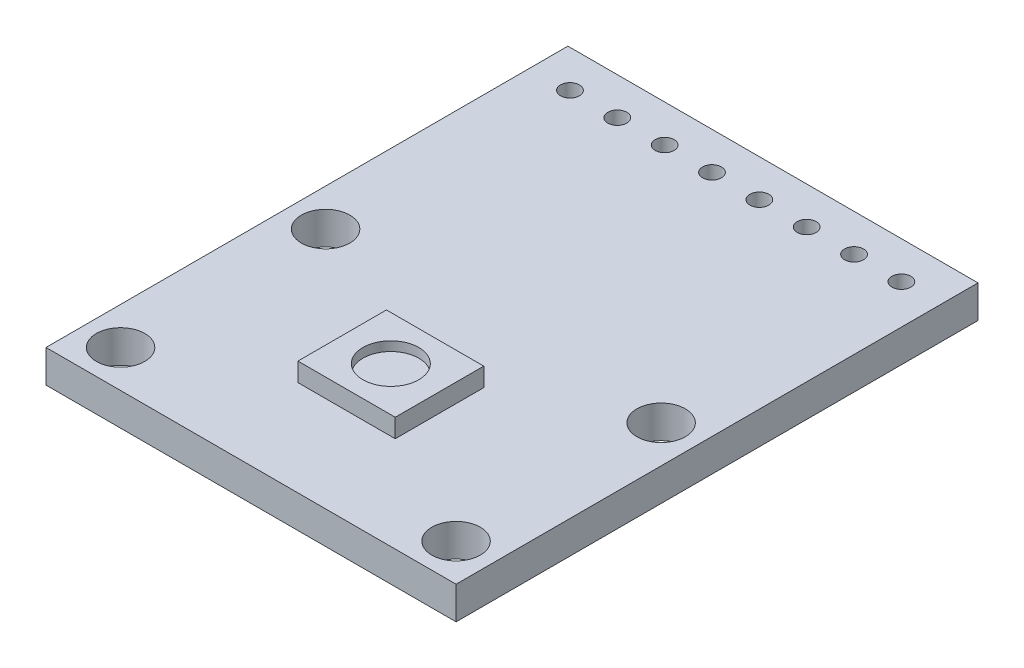
ISO-10303-21;
HEADER;
FILE_DESCRIPTION(('STEP AP214'),'2;1');
FILE_NAME('part.step','',(''),(''),'','','');
FILE_SCHEMA(('AUTOMOTIVE_DESIGN { 1 0 10303 214 1 1 1 1 }'));
ENDSEC;
DATA;
#1=APPLICATION_CONTEXT('core data for automotive mechanical design processes');
#2=APPLICATION_PROTOCOL_DEFINITION('international standard','automotive_design',2000,#1);
#3=PRODUCT_CONTEXT('',#1,'mechanical');
#4=PRODUCT('Part','Part','',(#3));
#5=PRODUCT_RELATED_PRODUCT_CATEGORY('part','',(#4));
#6=PRODUCT_DEFINITION_FORMATION('','',#4);
#7=PRODUCT_DEFINITION_CONTEXT('part definition',#1,'design');
#8=PRODUCT_DEFINITION('design','',#6,#7);
#9=PRODUCT_DEFINITION_SHAPE('','',#8);
#10=(LENGTH_UNIT() NAMED_UNIT(*) SI_UNIT(.MILLI.,.METRE.));
#11=(NAMED_UNIT(*) PLANE_ANGLE_UNIT() SI_UNIT($,.RADIAN.));
#12=(NAMED_UNIT(*) SI_UNIT($,.STERADIAN.) SOLID_ANGLE_UNIT());
#13=UNCERTAINTY_MEASURE_WITH_UNIT(LENGTH_MEASURE(1.E-05),#10,'distance_accuracy_value','');
#14=(GEOMETRIC_REPRESENTATION_CONTEXT(3) GLOBAL_UNCERTAINTY_ASSIGNED_CONTEXT((#13)) GLOBAL_UNIT_ASSIGNED_CONTEXT((#10,
#11,#12)) REPRESENTATION_CONTEXT('',''));
#15=CARTESIAN_POINT('',(0.,0.,0.));
#16=DIRECTION('',(0.,0.,1.));
#17=DIRECTION('',(1.,0.,0.));
#18=AXIS2_PLACEMENT_3D('',#15,#16,#17);
#19=CARTESIAN_POINT('',(0.,1.75,0.));
#20=DIRECTION('',(0.,1.,0.));
#21=DIRECTION('',(0.,0.,1.));
#22=AXIS2_PLACEMENT_3D('',#19,#20,#21);
#23=PLANE('',#22);
#24=CARTESIAN_POINT('',(6.35,1.75,-18.5));
#25=DIRECTION('',(0.,1.,0.));
#26=DIRECTION('',(0.,0.,1.));
#27=AXIS2_PLACEMENT_3D('',#24,#25,#26);
#28=CIRCLE('',#27,0.508);
#29=CARTESIAN_POINT('',(6.35,1.75,-17.992));
#30=VERTEX_POINT('',#29);
#31=EDGE_CURVE('E147',#30,#30,#28,.T.);
#32=ORIENTED_EDGE('',*,*,#31,.F.);
#33=EDGE_LOOP('',(#32));
#34=FACE_BOUND('',#33,.T.);
#35=CARTESIAN_POINT('',(1.27,1.75,-18.5));
#36=DIRECTION('',(0.,1.,0.));
#37=DIRECTION('',(0.,0.,1.));
#38=AXIS2_PLACEMENT_3D('',#35,#36,#37);
#39=CIRCLE('',#38,0.508);
#40=CARTESIAN_POINT('',(1.27,1.75,-17.992));
#41=VERTEX_POINT('',#40);
#42=EDGE_CURVE('E159',#41,#41,#39,.T.);
#43=ORIENTED_EDGE('',*,*,#42,.F.);
#44=EDGE_LOOP('',(#43));
#45=FACE_BOUND('',#44,.T.);
#46=CARTESIAN_POINT('',(-3.81,1.75,-18.5));
#47=DIRECTION('',(0.,1.,0.));
#48=DIRECTION('',(0.,0.,1.));
#49=AXIS2_PLACEMENT_3D('',#46,#47,#48);
#50=CIRCLE('',#49,0.508);
#51=CARTESIAN_POINT('',(-3.81,1.75,-17.992));
#52=VERTEX_POINT('',#51);
#53=EDGE_CURVE('E171',#52,#52,#50,.T.);
#54=ORIENTED_EDGE('',*,*,#53,.F.);
#55=EDGE_LOOP('',(#54));
#56=FACE_BOUND('',#55,.T.);
#57=CARTESIAN_POINT('',(-8.89,1.75,-18.5));
#58=DIRECTION('',(0.,1.,0.));
#59=DIRECTION('',(0.,0.,1.));
#60=AXIS2_PLACEMENT_3D('',#57,#58,#59);
#61=CIRCLE('',#60,0.508);
#62=CARTESIAN_POINT('',(-8.89,1.75,-17.992));
#63=VERTEX_POINT('',#62);
#64=EDGE_CURVE('E183',#63,#63,#61,.T.);
#65=ORIENTED_EDGE('',*,*,#64,.F.);
#66=EDGE_LOOP('',(#65));
#67=FACE_BOUND('',#66,.T.);
#68=CARTESIAN_POINT('',(9.,1.75,5.5));
#69=DIRECTION('',(0.,1.,0.));
#70=DIRECTION('',(0.,0.,1.));
#71=AXIS2_PLACEMENT_3D('',#68,#69,#70);
#72=CIRCLE('',#71,1.3);
#73=CARTESIAN_POINT('',(9.,1.75,6.8));
#74=VERTEX_POINT('',#73);
#75=EDGE_CURVE('E195',#74,#74,#72,.T.);
#76=ORIENTED_EDGE('',*,*,#75,.F.);
#77=EDGE_LOOP('',(#76));
#78=FACE_BOUND('',#77,.T.);
#79=CARTESIAN_POINT('',(-9.,1.75,-5.5));
#80=DIRECTION('',(0.,1.,0.));
#81=DIRECTION('',(0.,0.,1.));
#82=AXIS2_PLACEMENT_3D('',#79,#80,#81);
#83=CIRCLE('',#82,1.3);
#84=CARTESIAN_POINT('',(-9.,1.75,-4.2));
#85=VERTEX_POINT('',#84);
#86=EDGE_CURVE('E207',#85,#85,#83,.T.);
#87=ORIENTED_EDGE('',*,*,#86,.F.);
#88=EDGE_LOOP('',(#87));
#89=FACE_BOUND('',#88,.T.);
#90=DIRECTION('',(0.,0.,1.));
#91=VECTOR('',#90,1.);
#92=CARTESIAN_POINT('',(-11.,1.75,-20.5));
#93=LINE('',#92,#91);
#94=CARTESIAN_POINT('',(-11.,1.75,-20.5));
#95=VERTEX_POINT('',#94);
#96=CARTESIAN_POINT('',(-11.,1.75,7.49999999999999));
#97=VERTEX_POINT('',#96);
#98=EDGE_CURVE('E213',#95,#97,#93,.T.);
#99=ORIENTED_EDGE('',*,*,#98,.T.);
#100=DIRECTION('',(1.,0.,0.));
#101=VECTOR('',#100,1.);
#102=CARTESIAN_POINT('',(-11.,1.75,7.49999999999999));
#103=LINE('',#102,#101);
#104=CARTESIAN_POINT('',(11.,1.75,7.49999999999999));
#105=VERTEX_POINT('',#104);
#106=EDGE_CURVE('E89',#97,#105,#103,.T.);
#107=ORIENTED_EDGE('',*,*,#106,.T.);
#108=DIRECTION('',(0.,0.,-1.));
#109=VECTOR('',#108,1.);
#110=CARTESIAN_POINT('',(11.,1.75,-20.5));
#111=LINE('',#110,#109);
#112=CARTESIAN_POINT('',(11.,1.75,-20.5));
#113=VERTEX_POINT('',#112);
#114=EDGE_CURVE('E216',#105,#113,#111,.T.);
#115=ORIENTED_EDGE('',*,*,#114,.T.);
#116=DIRECTION('',(-1.,0.,0.));
#117=VECTOR('',#116,1.);
#118=CARTESIAN_POINT('',(-11.,1.75,-20.5));
#119=LINE('',#118,#117);
#120=EDGE_CURVE('E61',#113,#95,#119,.T.);
#121=ORIENTED_EDGE('',*,*,#120,.T.);
#122=EDGE_LOOP('',(#99,#107,#115,#121));
#123=FACE_BOUND('',#122,.T.);
#124=CARTESIAN_POINT('',(9.,1.75,-5.5));
#125=DIRECTION('',(0.,1.,0.));
#126=DIRECTION('',(0.,0.,1.));
#127=AXIS2_PLACEMENT_3D('',#124,#125,#126);
#128=CIRCLE('',#127,1.3);
#129=CARTESIAN_POINT('',(9.,1.75,-4.2));
#130=VERTEX_POINT('',#129);
#131=EDGE_CURVE('E201',#130,#130,#128,.T.);
#132=ORIENTED_EDGE('',*,*,#131,.F.);
#133=EDGE_LOOP('',(#132));
#134=FACE_BOUND('',#133,.T.);
#135=CARTESIAN_POINT('',(-9.,1.75,5.5));
#136=DIRECTION('',(0.,1.,0.));
#137=DIRECTION('',(0.,0.,1.));
#138=AXIS2_PLACEMENT_3D('',#135,#136,#137);
#139=CIRCLE('',#138,1.3);
#140=CARTESIAN_POINT('',(-9.,1.75,6.8));
#141=VERTEX_POINT('',#140);
#142=EDGE_CURVE('E189',#141,#141,#139,.T.);
#143=ORIENTED_EDGE('',*,*,#142,.F.);
#144=EDGE_LOOP('',(#143));
#145=FACE_BOUND('',#144,.T.);
#146=CARTESIAN_POINT('',(-6.35,1.75,-18.5));
#147=DIRECTION('',(0.,1.,0.));
#148=DIRECTION('',(0.,0.,1.));
#149=AXIS2_PLACEMENT_3D('',#146,#147,#148);
#150=CIRCLE('',#149,0.508);
#151=CARTESIAN_POINT('',(-6.35,1.75,-17.992));
#152=VERTEX_POINT('',#151);
#153=EDGE_CURVE('E177',#152,#152,#150,.T.);
#154=ORIENTED_EDGE('',*,*,#153,.F.);
#155=EDGE_LOOP('',(#154));
#156=FACE_BOUND('',#155,.T.);
#157=CARTESIAN_POINT('',(-1.27,1.75,-18.5));
#158=DIRECTION('',(0.,1.,0.));
#159=DIRECTION('',(0.,0.,1.));
#160=AXIS2_PLACEMENT_3D('',#157,#158,#159);
#161=CIRCLE('',#160,0.508);
#162=CARTESIAN_POINT('',(-1.27,1.75,-17.992));
#163=VERTEX_POINT('',#162);
#164=EDGE_CURVE('E165',#163,#163,#161,.T.);
#165=ORIENTED_EDGE('',*,*,#164,.F.);
#166=EDGE_LOOP('',(#165));
#167=FACE_BOUND('',#166,.T.);
#168=CARTESIAN_POINT('',(3.81,1.75,-18.5));
#169=DIRECTION('',(0.,1.,0.));
#170=DIRECTION('',(0.,0.,1.));
#171=AXIS2_PLACEMENT_3D('',#168,#169,#170);
#172=CIRCLE('',#171,0.508);
#173=CARTESIAN_POINT('',(3.81,1.75,-17.992));
#174=VERTEX_POINT('',#173);
#175=EDGE_CURVE('E153',#174,#174,#172,.T.);
#176=ORIENTED_EDGE('',*,*,#175,.F.);
#177=EDGE_LOOP('',(#176));
#178=FACE_BOUND('',#177,.T.);
#179=CARTESIAN_POINT('',(8.89,1.75,-18.5));
#180=DIRECTION('',(0.,1.,0.));
#181=DIRECTION('',(0.,0.,1.));
#182=AXIS2_PLACEMENT_3D('',#179,#180,#181);
#183=CIRCLE('',#182,0.508);
#184=CARTESIAN_POINT('',(8.89,1.75,-17.992));
#185=VERTEX_POINT('',#184);
#186=EDGE_CURVE('E139',#185,#185,#183,.T.);
#187=ORIENTED_EDGE('',*,*,#186,.F.);
#188=EDGE_LOOP('',(#187));
#189=FACE_BOUND('',#188,.T.);
#190=DIRECTION('',(-1.,0.,0.));
#191=VECTOR('',#190,1.);
#192=CARTESIAN_POINT('',(-2.61,1.75,-2.375));
#193=LINE('',#192,#191);
#194=CARTESIAN_POINT('',(2.61,1.75,-2.375));
#195=VERTEX_POINT('',#194);
#196=CARTESIAN_POINT('',(-2.61,1.75,-2.375));
#197=VERTEX_POINT('',#196);
#198=EDGE_CURVE('E336',#195,#197,#193,.T.);
#199=ORIENTED_EDGE('',*,*,#198,.F.);
#200=DIRECTION('',(0.,0.,-1.));
#201=VECTOR('',#200,1.);
#202=CARTESIAN_POINT('',(2.61,1.75,-2.375));
#203=LINE('',#202,#201);
#204=CARTESIAN_POINT('',(2.61,1.75,2.375));
#205=VERTEX_POINT('',#204);
#206=EDGE_CURVE('E134',#205,#195,#203,.T.);
#207=ORIENTED_EDGE('',*,*,#206,.F.);
#208=DIRECTION('',(1.,0.,0.));
#209=VECTOR('',#208,1.);
#210=CARTESIAN_POINT('',(-2.61,1.75,2.375));
#211=LINE('',#210,#209);
#212=CARTESIAN_POINT('',(-2.61,1.75,2.375));
#213=VERTEX_POINT('',#212);
#214=EDGE_CURVE('E130',#213,#205,#211,.T.);
#215=ORIENTED_EDGE('',*,*,#214,.F.);
#216=DIRECTION('',(0.,0.,1.));
#217=VECTOR('',#216,1.);
#218=CARTESIAN_POINT('',(-2.61,1.75,-2.375));
#219=LINE('',#218,#217);
#220=EDGE_CURVE('E345',#197,#213,#219,.T.);
#221=ORIENTED_EDGE('',*,*,#220,.F.);
#222=EDGE_LOOP('',(#199,#207,#215,#221));
#223=FACE_BOUND('',#222,.T.);
#224=ADVANCED_FACE('F37',(#34,#45,#56,#67,#78,#89,#123,#134,#145,#156,#167,#178,#189,#223),#23,.T.);
#225=CARTESIAN_POINT('',(0.,0.,0.));
#226=DIRECTION('',(0.,1.,0.));
#227=DIRECTION('',(0.,0.,1.));
#228=AXIS2_PLACEMENT_3D('',#225,#226,#227);
#229=PLANE('',#228);
#230=DIRECTION('',(0.,0.,1.));
#231=VECTOR('',#230,1.);
#232=CARTESIAN_POINT('',(-11.,0.,-20.5));
#233=LINE('',#232,#231);
#234=CARTESIAN_POINT('',(-11.,0.,-20.5));
#235=VERTEX_POINT('',#234);
#236=CARTESIAN_POINT('',(-11.,0.,7.49999999999999));
#237=VERTEX_POINT('',#236);
#238=EDGE_CURVE('E210',#235,#237,#233,.T.);
#239=ORIENTED_EDGE('',*,*,#238,.F.);
#240=DIRECTION('',(-1.,0.,0.));
#241=VECTOR('',#240,1.);
#242=CARTESIAN_POINT('',(-11.,0.,-20.5));
#243=LINE('',#242,#241);
#244=CARTESIAN_POINT('',(11.,0.,-20.5));
#245=VERTEX_POINT('',#244);
#246=EDGE_CURVE('E82',#245,#235,#243,.T.);
#247=ORIENTED_EDGE('',*,*,#246,.F.);
#248=DIRECTION('',(0.,0.,-1.));
#249=VECTOR('',#248,1.);
#250=CARTESIAN_POINT('',(11.,0.,-20.5));
#251=LINE('',#250,#249);
#252=CARTESIAN_POINT('',(11.,0.,7.49999999999999));
#253=VERTEX_POINT('',#252);
#254=EDGE_CURVE('E224',#253,#245,#251,.T.);
#255=ORIENTED_EDGE('',*,*,#254,.F.);
#256=DIRECTION('',(1.,0.,0.));
#257=VECTOR('',#256,1.);
#258=CARTESIAN_POINT('',(-11.,0.,7.49999999999999));
#259=LINE('',#258,#257);
#260=EDGE_CURVE('E222',#237,#253,#259,.T.);
#261=ORIENTED_EDGE('',*,*,#260,.F.);
#262=EDGE_LOOP('',(#239,#247,#255,#261));
#263=FACE_BOUND('',#262,.T.);
#264=CARTESIAN_POINT('',(-9.,0.,-5.5));
#265=DIRECTION('',(0.,1.,0.));
#266=DIRECTION('',(0.,0.,1.));
#267=AXIS2_PLACEMENT_3D('',#264,#265,#266);
#268=CIRCLE('',#267,1.3);
#269=CARTESIAN_POINT('',(-9.,0.,-4.2));
#270=VERTEX_POINT('',#269);
#271=EDGE_CURVE('E204',#270,#270,#268,.T.);
#272=ORIENTED_EDGE('',*,*,#271,.T.);
#273=EDGE_LOOP('',(#272));
#274=FACE_BOUND('',#273,.T.);
#275=CARTESIAN_POINT('',(9.,0.,-5.5));
#276=DIRECTION('',(0.,1.,0.));
#277=DIRECTION('',(0.,0.,1.));
#278=AXIS2_PLACEMENT_3D('',#275,#276,#277);
#279=CIRCLE('',#278,1.3);
#280=CARTESIAN_POINT('',(9.,0.,-4.2));
#281=VERTEX_POINT('',#280);
#282=EDGE_CURVE('E198',#281,#281,#279,.T.);
#283=ORIENTED_EDGE('',*,*,#282,.T.);
#284=EDGE_LOOP('',(#283));
#285=FACE_BOUND('',#284,.T.);
#286=CARTESIAN_POINT('',(9.,0.,5.5));
#287=DIRECTION('',(0.,1.,0.));
#288=DIRECTION('',(0.,0.,1.));
#289=AXIS2_PLACEMENT_3D('',#286,#287,#288);
#290=CIRCLE('',#289,1.3);
#291=CARTESIAN_POINT('',(9.,0.,6.8));
#292=VERTEX_POINT('',#291);
#293=EDGE_CURVE('E192',#292,#292,#290,.T.);
#294=ORIENTED_EDGE('',*,*,#293,.T.);
#295=EDGE_LOOP('',(#294));
#296=FACE_BOUND('',#295,.T.);
#297=CARTESIAN_POINT('',(-9.,0.,5.5));
#298=DIRECTION('',(0.,1.,0.));
#299=DIRECTION('',(0.,0.,1.));
#300=AXIS2_PLACEMENT_3D('',#297,#298,#299);
#301=CIRCLE('',#300,1.3);
#302=CARTESIAN_POINT('',(-9.,0.,6.8));
#303=VERTEX_POINT('',#302);
#304=EDGE_CURVE('E186',#303,#303,#301,.T.);
#305=ORIENTED_EDGE('',*,*,#304,.T.);
#306=EDGE_LOOP('',(#305));
#307=FACE_BOUND('',#306,.T.);
#308=CARTESIAN_POINT('',(-8.89,0.,-18.5));
#309=DIRECTION('',(0.,1.,0.));
#310=DIRECTION('',(0.,0.,1.));
#311=AXIS2_PLACEMENT_3D('',#308,#309,#310);
#312=CIRCLE('',#311,0.508);
#313=CARTESIAN_POINT('',(-8.89,0.,-17.992));
#314=VERTEX_POINT('',#313);
#315=EDGE_CURVE('E180',#314,#314,#312,.T.);
#316=ORIENTED_EDGE('',*,*,#315,.T.);
#317=EDGE_LOOP('',(#316));
#318=FACE_BOUND('',#317,.T.);
#319=CARTESIAN_POINT('',(-6.35,0.,-18.5));
#320=DIRECTION('',(0.,1.,0.));
#321=DIRECTION('',(0.,0.,1.));
#322=AXIS2_PLACEMENT_3D('',#319,#320,#321);
#323=CIRCLE('',#322,0.508);
#324=CARTESIAN_POINT('',(-6.35,0.,-17.992));
#325=VERTEX_POINT('',#324);
#326=EDGE_CURVE('E174',#325,#325,#323,.T.);
#327=ORIENTED_EDGE('',*,*,#326,.T.);
#328=EDGE_LOOP('',(#327));
#329=FACE_BOUND('',#328,.T.);
#330=CARTESIAN_POINT('',(-3.81,0.,-18.5));
#331=DIRECTION('',(0.,1.,0.));
#332=DIRECTION('',(0.,0.,1.));
#333=AXIS2_PLACEMENT_3D('',#330,#331,#332);
#334=CIRCLE('',#333,0.508);
#335=CARTESIAN_POINT('',(-3.81,0.,-17.992));
#336=VERTEX_POINT('',#335);
#337=EDGE_CURVE('E168',#336,#336,#334,.T.);
#338=ORIENTED_EDGE('',*,*,#337,.T.);
#339=EDGE_LOOP('',(#338));
#340=FACE_BOUND('',#339,.T.);
#341=CARTESIAN_POINT('',(-1.27,0.,-18.5));
#342=DIRECTION('',(0.,1.,0.));
#343=DIRECTION('',(0.,0.,1.));
#344=AXIS2_PLACEMENT_3D('',#341,#342,#343);
#345=CIRCLE('',#344,0.508);
#346=CARTESIAN_POINT('',(-1.27,0.,-17.992));
#347=VERTEX_POINT('',#346);
#348=EDGE_CURVE('E162',#347,#347,#345,.T.);
#349=ORIENTED_EDGE('',*,*,#348,.T.);
#350=EDGE_LOOP('',(#349));
#351=FACE_BOUND('',#350,.T.);
#352=CARTESIAN_POINT('',(1.27,0.,-18.5));
#353=DIRECTION('',(0.,1.,0.));
#354=DIRECTION('',(0.,0.,1.));
#355=AXIS2_PLACEMENT_3D('',#352,#353,#354);
#356=CIRCLE('',#355,0.508);
#357=CARTESIAN_POINT('',(1.27,0.,-17.992));
#358=VERTEX_POINT('',#357);
#359=EDGE_CURVE('E156',#358,#358,#356,.T.);
#360=ORIENTED_EDGE('',*,*,#359,.T.);
#361=EDGE_LOOP('',(#360));
#362=FACE_BOUND('',#361,.T.);
#363=CARTESIAN_POINT('',(3.81,0.,-18.5));
#364=DIRECTION('',(0.,1.,0.));
#365=DIRECTION('',(0.,0.,1.));
#366=AXIS2_PLACEMENT_3D('',#363,#364,#365);
#367=CIRCLE('',#366,0.508);
#368=CARTESIAN_POINT('',(3.81,0.,-17.992));
#369=VERTEX_POINT('',#368);
#370=EDGE_CURVE('E150',#369,#369,#367,.T.);
#371=ORIENTED_EDGE('',*,*,#370,.T.);
#372=EDGE_LOOP('',(#371));
#373=FACE_BOUND('',#372,.T.);
#374=CARTESIAN_POINT('',(6.35,0.,-18.5));
#375=DIRECTION('',(0.,1.,0.));
#376=DIRECTION('',(0.,0.,1.));
#377=AXIS2_PLACEMENT_3D('',#374,#375,#376);
#378=CIRCLE('',#377,0.508);
#379=CARTESIAN_POINT('',(6.35,0.,-17.992));
#380=VERTEX_POINT('',#379);
#381=EDGE_CURVE('E145',#380,#380,#378,.T.);
#382=ORIENTED_EDGE('',*,*,#381,.T.);
#383=EDGE_LOOP('',(#382));
#384=FACE_BOUND('',#383,.T.);
#385=CARTESIAN_POINT('',(8.89,0.,-18.5));
#386=DIRECTION('',(0.,1.,0.));
#387=DIRECTION('',(0.,0.,1.));
#388=AXIS2_PLACEMENT_3D('',#385,#386,#387);
#389=CIRCLE('',#388,0.508);
#390=CARTESIAN_POINT('',(8.89,0.,-17.992));
#391=VERTEX_POINT('',#390);
#392=EDGE_CURVE('E136',#391,#391,#389,.T.);
#393=ORIENTED_EDGE('',*,*,#392,.T.);
#394=EDGE_LOOP('',(#393));
#395=FACE_BOUND('',#394,.T.);
#396=ADVANCED_FACE('F237',(#263,#274,#285,#296,#307,#318,#329,#340,#351,#362,#373,#384,#395),
#229,.F.);
#397=CARTESIAN_POINT('',(-11.,1.75,-20.5));
#398=DIRECTION('',(1.,0.,0.));
#399=DIRECTION('',(0.,0.,-1.));
#400=AXIS2_PLACEMENT_3D('',#397,#398,#399);
#401=PLANE('',#400);
#402=ORIENTED_EDGE('',*,*,#238,.T.);
#403=DIRECTION('',(0.,-1.,0.));
#404=VECTOR('',#403,1.);
#405=CARTESIAN_POINT('',(-11.,1.75,7.49999999999999));
#406=LINE('',#405,#404);
#407=EDGE_CURVE('E11',#97,#237,#406,.T.);
#408=ORIENTED_EDGE('',*,*,#407,.F.);
#409=ORIENTED_EDGE('',*,*,#98,.F.);
#410=DIRECTION('',(0.,-1.,0.));
#411=VECTOR('',#410,1.);
#412=CARTESIAN_POINT('',(-11.,1.75,-20.5));
#413=LINE('',#412,#411);
#414=EDGE_CURVE('E219',#95,#235,#413,.T.);
#415=ORIENTED_EDGE('',*,*,#414,.T.);
#416=EDGE_LOOP('',(#402,#408,#409,#415));
#417=FACE_BOUND('',#416,.T.);
#418=ADVANCED_FACE('F39',(#417),#401,.F.);
#419=CARTESIAN_POINT('',(-11.,1.75,7.49999999999999));
#420=DIRECTION('',(0.,0.,-1.));
#421=DIRECTION('',(-1.,0.,0.));
#422=AXIS2_PLACEMENT_3D('',#419,#420,#421);
#423=PLANE('',#422);
#424=ORIENTED_EDGE('',*,*,#260,.T.);
#425=DIRECTION('',(0.,-1.,0.));
#426=VECTOR('',#425,1.);
#427=CARTESIAN_POINT('',(11.,1.75,7.49999999999999));
#428=LINE('',#427,#426);
#429=EDGE_CURVE('E45',#105,#253,#428,.T.);
#430=ORIENTED_EDGE('',*,*,#429,.F.);
#431=ORIENTED_EDGE('',*,*,#106,.F.);
#432=ORIENTED_EDGE('',*,*,#407,.T.);
#433=EDGE_LOOP('',(#424,#430,#431,#432));
#434=FACE_BOUND('',#433,.T.);
#435=ADVANCED_FACE('F253',(#434),#423,.F.);
#436=CARTESIAN_POINT('',(11.,1.75,-20.5));
#437=DIRECTION('',(-1.,0.,0.));
#438=DIRECTION('',(0.,0.,1.));
#439=AXIS2_PLACEMENT_3D('',#436,#437,#438);
#440=PLANE('',#439);
#441=ORIENTED_EDGE('',*,*,#254,.T.);
#442=DIRECTION('',(0.,-1.,0.));
#443=VECTOR('',#442,1.);
#444=CARTESIAN_POINT('',(11.,1.75,-20.5));
#445=LINE('',#444,#443);
#446=EDGE_CURVE('E228',#113,#245,#445,.T.);
#447=ORIENTED_EDGE('',*,*,#446,.F.);
#448=ORIENTED_EDGE('',*,*,#114,.F.);
#449=ORIENTED_EDGE('',*,*,#429,.T.);
#450=EDGE_LOOP('',(#441,#447,#448,#449));
#451=FACE_BOUND('',#450,.T.);
#452=ADVANCED_FACE('F233',(#451),#440,.F.);
#453=CARTESIAN_POINT('',(-11.,1.75,-20.5));
#454=DIRECTION('',(0.,0.,1.));
#455=DIRECTION('',(1.,0.,0.));
#456=AXIS2_PLACEMENT_3D('',#453,#454,#455);
#457=PLANE('',#456);
#458=ORIENTED_EDGE('',*,*,#246,.T.);
#459=ORIENTED_EDGE('',*,*,#414,.F.);
#460=ORIENTED_EDGE('',*,*,#120,.F.);
#461=ORIENTED_EDGE('',*,*,#446,.T.);
#462=EDGE_LOOP('',(#458,#459,#460,#461));
#463=FACE_BOUND('',#462,.T.);
#464=ADVANCED_FACE('F242',(#463),#457,.F.);
#465=CARTESIAN_POINT('',(-9.,1.75,-5.5));
#466=DIRECTION('',(0.,-1.,0.));
#467=DIRECTION('',(0.,0.,-1.));
#468=AXIS2_PLACEMENT_3D('',#465,#466,#467);
#469=CYLINDRICAL_SURFACE('',#468,1.3);
#470=ORIENTED_EDGE('',*,*,#86,.T.);
#471=EDGE_LOOP('',(#470));
#472=FACE_BOUND('',#471,.T.);
#473=ORIENTED_EDGE('',*,*,#271,.F.);
#474=EDGE_LOOP('',(#473));
#475=FACE_BOUND('',#474,.T.);
#476=ADVANCED_FACE('F244',(#472,#475),#469,.F.);
#477=CARTESIAN_POINT('',(9.,1.75,-5.5));
#478=DIRECTION('',(0.,-1.,0.));
#479=DIRECTION('',(0.,0.,-1.));
#480=AXIS2_PLACEMENT_3D('',#477,#478,#479);
#481=CYLINDRICAL_SURFACE('',#480,1.3);
#482=ORIENTED_EDGE('',*,*,#131,.T.);
#483=EDGE_LOOP('',(#482));
#484=FACE_BOUND('',#483,.T.);
#485=ORIENTED_EDGE('',*,*,#282,.F.);
#486=EDGE_LOOP('',(#485));
#487=FACE_BOUND('',#486,.T.);
#488=ADVANCED_FACE('F250',(#484,#487),#481,.F.);
#489=CARTESIAN_POINT('',(9.,1.75,5.5));
#490=DIRECTION('',(0.,-1.,0.));
#491=DIRECTION('',(0.,0.,-1.));
#492=AXIS2_PLACEMENT_3D('',#489,#490,#491);
#493=CYLINDRICAL_SURFACE('',#492,1.3);
#494=ORIENTED_EDGE('',*,*,#75,.T.);
#495=EDGE_LOOP('',(#494));
#496=FACE_BOUND('',#495,.T.);
#497=ORIENTED_EDGE('',*,*,#293,.F.);
#498=EDGE_LOOP('',(#497));
#499=FACE_BOUND('',#498,.T.);
#500=ADVANCED_FACE('F267',(#496,#499),#493,.F.);
#501=CARTESIAN_POINT('',(-9.,1.75,5.5));
#502=DIRECTION('',(0.,-1.,0.));
#503=DIRECTION('',(0.,0.,-1.));
#504=AXIS2_PLACEMENT_3D('',#501,#502,#503);
#505=CYLINDRICAL_SURFACE('',#504,1.3);
#506=ORIENTED_EDGE('',*,*,#142,.T.);
#507=EDGE_LOOP('',(#506));
#508=FACE_BOUND('',#507,.T.);
#509=ORIENTED_EDGE('',*,*,#304,.F.);
#510=EDGE_LOOP('',(#509));
#511=FACE_BOUND('',#510,.T.);
#512=ADVANCED_FACE('F271',(#508,#511),#505,.F.);
#513=CARTESIAN_POINT('',(-8.89,1.75,-18.5));
#514=DIRECTION('',(0.,-1.,0.));
#515=DIRECTION('',(0.,0.,-1.));
#516=AXIS2_PLACEMENT_3D('',#513,#514,#515);
#517=CYLINDRICAL_SURFACE('',#516,0.508);
#518=ORIENTED_EDGE('',*,*,#64,.T.);
#519=EDGE_LOOP('',(#518));
#520=FACE_BOUND('',#519,.T.);
#521=ORIENTED_EDGE('',*,*,#315,.F.);
#522=EDGE_LOOP('',(#521));
#523=FACE_BOUND('',#522,.T.);
#524=ADVANCED_FACE('F275',(#520,#523),#517,.F.);
#525=CARTESIAN_POINT('',(-6.35,1.75,-18.5));
#526=DIRECTION('',(0.,-1.,0.));
#527=DIRECTION('',(0.,0.,-1.));
#528=AXIS2_PLACEMENT_3D('',#525,#526,#527);
#529=CYLINDRICAL_SURFACE('',#528,0.508);
#530=ORIENTED_EDGE('',*,*,#153,.T.);
#531=EDGE_LOOP('',(#530));
#532=FACE_BOUND('',#531,.T.);
#533=ORIENTED_EDGE('',*,*,#326,.F.);
#534=EDGE_LOOP('',(#533));
#535=FACE_BOUND('',#534,.T.);
#536=ADVANCED_FACE('F279',(#532,#535),#529,.F.);
#537=CARTESIAN_POINT('',(-3.81,1.75,-18.5));
#538=DIRECTION('',(0.,-1.,0.));
#539=DIRECTION('',(0.,0.,-1.));
#540=AXIS2_PLACEMENT_3D('',#537,#538,#539);
#541=CYLINDRICAL_SURFACE('',#540,0.508);
#542=ORIENTED_EDGE('',*,*,#53,.T.);
#543=EDGE_LOOP('',(#542));
#544=FACE_BOUND('',#543,.T.);
#545=ORIENTED_EDGE('',*,*,#337,.F.);
#546=EDGE_LOOP('',(#545));
#547=FACE_BOUND('',#546,.T.);
#548=ADVANCED_FACE('F283',(#544,#547),#541,.F.);
#549=CARTESIAN_POINT('',(-1.27,1.75,-18.5));
#550=DIRECTION('',(0.,-1.,0.));
#551=DIRECTION('',(0.,0.,-1.));
#552=AXIS2_PLACEMENT_3D('',#549,#550,#551);
#553=CYLINDRICAL_SURFACE('',#552,0.508);
#554=ORIENTED_EDGE('',*,*,#164,.T.);
#555=EDGE_LOOP('',(#554));
#556=FACE_BOUND('',#555,.T.);
#557=ORIENTED_EDGE('',*,*,#348,.F.);
#558=EDGE_LOOP('',(#557));
#559=FACE_BOUND('',#558,.T.);
#560=ADVANCED_FACE('F287',(#556,#559),#553,.F.);
#561=CARTESIAN_POINT('',(1.27,1.75,-18.5));
#562=DIRECTION('',(0.,-1.,0.));
#563=DIRECTION('',(0.,0.,-1.));
#564=AXIS2_PLACEMENT_3D('',#561,#562,#563);
#565=CYLINDRICAL_SURFACE('',#564,0.508);
#566=ORIENTED_EDGE('',*,*,#42,.T.);
#567=EDGE_LOOP('',(#566));
#568=FACE_BOUND('',#567,.T.);
#569=ORIENTED_EDGE('',*,*,#359,.F.);
#570=EDGE_LOOP('',(#569));
#571=FACE_BOUND('',#570,.T.);
#572=ADVANCED_FACE('F291',(#568,#571),#565,.F.);
#573=CARTESIAN_POINT('',(3.81,1.75,-18.5));
#574=DIRECTION('',(0.,-1.,0.));
#575=DIRECTION('',(0.,0.,-1.));
#576=AXIS2_PLACEMENT_3D('',#573,#574,#575);
#577=CYLINDRICAL_SURFACE('',#576,0.508);
#578=ORIENTED_EDGE('',*,*,#175,.T.);
#579=EDGE_LOOP('',(#578));
#580=FACE_BOUND('',#579,.T.);
#581=ORIENTED_EDGE('',*,*,#370,.F.);
#582=EDGE_LOOP('',(#581));
#583=FACE_BOUND('',#582,.T.);
#584=ADVANCED_FACE('F295',(#580,#583),#577,.F.);
#585=CARTESIAN_POINT('',(6.35,1.75,-18.5));
#586=DIRECTION('',(0.,-1.,0.));
#587=DIRECTION('',(0.,0.,-1.));
#588=AXIS2_PLACEMENT_3D('',#585,#586,#587);
#589=CYLINDRICAL_SURFACE('',#588,0.508);
#590=ORIENTED_EDGE('',*,*,#31,.T.);
#591=EDGE_LOOP('',(#590));
#592=FACE_BOUND('',#591,.T.);
#593=ORIENTED_EDGE('',*,*,#381,.F.);
#594=EDGE_LOOP('',(#593));
#595=FACE_BOUND('',#594,.T.);
#596=ADVANCED_FACE('F299',(#592,#595),#589,.F.);
#597=CARTESIAN_POINT('',(8.89,1.75,-18.5));
#598=DIRECTION('',(0.,-1.,0.));
#599=DIRECTION('',(0.,0.,-1.));
#600=AXIS2_PLACEMENT_3D('',#597,#598,#599);
#601=CYLINDRICAL_SURFACE('',#600,0.508);
#602=ORIENTED_EDGE('',*,*,#186,.T.);
#603=EDGE_LOOP('',(#602));
#604=FACE_BOUND('',#603,.T.);
#605=ORIENTED_EDGE('',*,*,#392,.F.);
#606=EDGE_LOOP('',(#605));
#607=FACE_BOUND('',#606,.T.);
#608=ADVANCED_FACE('F303',(#604,#607),#601,.F.);
#609=CARTESIAN_POINT('',(2.61,2.75,-2.375));
#610=DIRECTION('',(-1.,0.,0.));
#611=DIRECTION('',(0.,0.,1.));
#612=AXIS2_PLACEMENT_3D('',#609,#610,#611);
#613=PLANE('',#612);
#614=ORIENTED_EDGE('',*,*,#206,.T.);
#615=DIRECTION('',(0.,-1.,0.));
#616=VECTOR('',#615,1.);
#617=CARTESIAN_POINT('',(2.61,2.75,-2.375));
#618=LINE('',#617,#616);
#619=CARTESIAN_POINT('',(2.61,2.75,-2.375));
#620=VERTEX_POINT('',#619);
#621=EDGE_CURVE('E115',#620,#195,#618,.T.);
#622=ORIENTED_EDGE('',*,*,#621,.F.);
#623=DIRECTION('',(0.,0.,-1.));
#624=VECTOR('',#623,1.);
#625=CARTESIAN_POINT('',(2.61,2.75,-2.375));
#626=LINE('',#625,#624);
#627=CARTESIAN_POINT('',(2.61,2.75,2.375));
#628=VERTEX_POINT('',#627);
#629=EDGE_CURVE('E122',#628,#620,#626,.T.);
#630=ORIENTED_EDGE('',*,*,#629,.F.);
#631=DIRECTION('',(0.,-1.,0.));
#632=VECTOR('',#631,1.);
#633=CARTESIAN_POINT('',(2.61,2.75,2.375));
#634=LINE('',#633,#632);
#635=EDGE_CURVE('E342',#628,#205,#634,.T.);
#636=ORIENTED_EDGE('',*,*,#635,.T.);
#637=EDGE_LOOP('',(#614,#622,#630,#636));
#638=FACE_BOUND('',#637,.T.);
#639=ADVANCED_FACE('F132',(#638),#613,.F.);
#640=CARTESIAN_POINT('',(-2.61,2.75,-2.375));
#641=DIRECTION('',(0.,0.,1.));
#642=DIRECTION('',(1.,0.,0.));
#643=AXIS2_PLACEMENT_3D('',#640,#641,#642);
#644=PLANE('',#643);
#645=ORIENTED_EDGE('',*,*,#198,.T.);
#646=DIRECTION('',(0.,-1.,0.));
#647=VECTOR('',#646,1.);
#648=CARTESIAN_POINT('',(-2.61,2.75,-2.375));
#649=LINE('',#648,#647);
#650=CARTESIAN_POINT('',(-2.61,2.75,-2.375));
#651=VERTEX_POINT('',#650);
#652=EDGE_CURVE('E118',#651,#197,#649,.T.);
#653=ORIENTED_EDGE('',*,*,#652,.F.);
#654=DIRECTION('',(-1.,0.,0.));
#655=VECTOR('',#654,1.);
#656=CARTESIAN_POINT('',(-2.61,2.75,-2.375));
#657=LINE('',#656,#655);
#658=EDGE_CURVE('E111',#620,#651,#657,.T.);
#659=ORIENTED_EDGE('',*,*,#658,.F.);
#660=ORIENTED_EDGE('',*,*,#621,.T.);
#661=EDGE_LOOP('',(#645,#653,#659,#660));
#662=FACE_BOUND('',#661,.T.);
#663=ADVANCED_FACE('F113',(#662),#644,.F.);
#664=CARTESIAN_POINT('',(-2.61,2.75,-2.375));
#665=DIRECTION('',(1.,0.,0.));
#666=DIRECTION('',(0.,0.,-1.));
#667=AXIS2_PLACEMENT_3D('',#664,#665,#666);
#668=PLANE('',#667);
#669=ORIENTED_EDGE('',*,*,#220,.T.);
#670=DIRECTION('',(0.,-1.,0.));
#671=VECTOR('',#670,1.);
#672=CARTESIAN_POINT('',(-2.61,2.75,2.375));
#673=LINE('',#672,#671);
#674=CARTESIAN_POINT('',(-2.61,2.75,2.375));
#675=VERTEX_POINT('',#674);
#676=EDGE_CURVE('E52',#675,#213,#673,.T.);
#677=ORIENTED_EDGE('',*,*,#676,.F.);
#678=DIRECTION('',(0.,0.,1.));
#679=VECTOR('',#678,1.);
#680=CARTESIAN_POINT('',(-2.61,2.75,-2.375));
#681=LINE('',#680,#679);
#682=EDGE_CURVE('E121',#651,#675,#681,.T.);
#683=ORIENTED_EDGE('',*,*,#682,.F.);
#684=ORIENTED_EDGE('',*,*,#652,.T.);
#685=EDGE_LOOP('',(#669,#677,#683,#684));
#686=FACE_BOUND('',#685,.T.);
#687=ADVANCED_FACE('F312',(#686),#668,.F.);
#688=CARTESIAN_POINT('',(-2.61,2.75,2.375));
#689=DIRECTION('',(0.,0.,-1.));
#690=DIRECTION('',(-1.,0.,0.));
#691=AXIS2_PLACEMENT_3D('',#688,#689,#690);
#692=PLANE('',#691);
#693=ORIENTED_EDGE('',*,*,#214,.T.);
#694=ORIENTED_EDGE('',*,*,#635,.F.);
#695=DIRECTION('',(1.,0.,0.));
#696=VECTOR('',#695,1.);
#697=CARTESIAN_POINT('',(-2.61,2.75,2.375));
#698=LINE('',#697,#696);
#699=EDGE_CURVE('E126',#675,#628,#698,.T.);
#700=ORIENTED_EDGE('',*,*,#699,.F.);
#701=ORIENTED_EDGE('',*,*,#676,.T.);
#702=EDGE_LOOP('',(#693,#694,#700,#701));
#703=FACE_BOUND('',#702,.T.);
#704=ADVANCED_FACE('F315',(#703),#692,.F.);
#705=CARTESIAN_POINT('',(0.,2.75,0.));
#706=DIRECTION('',(0.,1.,0.));
#707=DIRECTION('',(0.,0.,1.));
#708=AXIS2_PLACEMENT_3D('',#705,#706,#707);
#709=PLANE('',#708);
#710=CARTESIAN_POINT('',(0.,2.75,0.));
#711=DIRECTION('',(0.,1.,0.));
#712=DIRECTION('',(0.,0.,1.));
#713=AXIS2_PLACEMENT_3D('',#710,#711,#712);
#714=CIRCLE('',#713,1.5);
#715=CARTESIAN_POINT('',(0.,2.75,1.5));
#716=VERTEX_POINT('',#715);
#717=EDGE_CURVE('E334',#716,#716,#714,.T.);
#718=ORIENTED_EDGE('',*,*,#717,.F.);
#719=EDGE_LOOP('',(#718));
#720=FACE_BOUND('',#719,.T.);
#721=ORIENTED_EDGE('',*,*,#629,.T.);
#722=ORIENTED_EDGE('',*,*,#658,.T.);
#723=ORIENTED_EDGE('',*,*,#682,.T.);
#724=ORIENTED_EDGE('',*,*,#699,.T.);
#725=EDGE_LOOP('',(#721,#722,#723,#724));
#726=FACE_BOUND('',#725,.T.);
#727=ADVANCED_FACE('F125',(#720,#726),#709,.T.);
#728=CARTESIAN_POINT('',(0.,2.25,0.));
#729=DIRECTION('',(0.,1.,0.));
#730=DIRECTION('',(0.,0.,1.));
#731=AXIS2_PLACEMENT_3D('',#728,#729,#730);
#732=CYLINDRICAL_SURFACE('',#731,1.5);
#733=CARTESIAN_POINT('',(0.,2.25,0.));
#734=DIRECTION('',(0.,1.,0.));
#735=DIRECTION('',(0.,0.,1.));
#736=AXIS2_PLACEMENT_3D('',#733,#734,#735);
#737=CIRCLE('',#736,1.5);
#738=CARTESIAN_POINT('',(0.,2.25,1.5));
#739=VERTEX_POINT('',#738);
#740=EDGE_CURVE('E333',#739,#739,#737,.T.);
#741=ORIENTED_EDGE('',*,*,#740,.F.);
#742=EDGE_LOOP('',(#741));
#743=FACE_BOUND('',#742,.T.);
#744=ORIENTED_EDGE('',*,*,#717,.T.);
#745=EDGE_LOOP('',(#744));
#746=FACE_BOUND('',#745,.T.);
#747=ADVANCED_FACE('F321',(#743,#746),#732,.F.);
#748=CARTESIAN_POINT('',(0.,2.25,0.));
#749=DIRECTION('',(0.,1.,0.));
#750=DIRECTION('',(0.,0.,1.));
#751=AXIS2_PLACEMENT_3D('',#748,#749,#750);
#752=PLANE('',#751);
#753=ORIENTED_EDGE('',*,*,#740,.T.);
#754=EDGE_LOOP('',(#753));
#755=FACE_BOUND('',#754,.T.);
#756=ADVANCED_FACE('F325',(#755),#752,.T.);
#757=CLOSED_SHELL('',(#224,#396,#418,#435,#452,#464,#476,#488,#500,#512,#524,#536,#548,#560,
#572,#584,#596,#608,#639,#663,#687,#704,#727,#747,#756));
#758=MANIFOLD_SOLID_BREP('B2',#757);
#759=ADVANCED_BREP_SHAPE_REPRESENTATION('',(#18,#758),#14);
#760=SHAPE_DEFINITION_REPRESENTATION(#9,#759);
ENDSEC;
END-ISO-10303-21;
